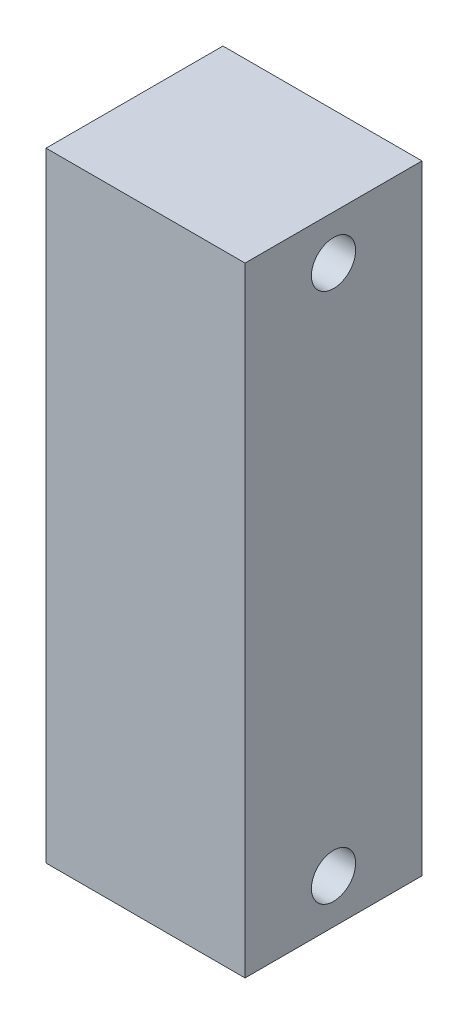
ISO-10303-21;
HEADER;
FILE_DESCRIPTION(('STEP AP214'),'2;1');
FILE_NAME('part.step','',(''),(''),'','','');
FILE_SCHEMA(('AUTOMOTIVE_DESIGN { 1 0 10303 214 1 1 1 1 }'));
ENDSEC;
DATA;
#1=APPLICATION_CONTEXT('core data for automotive mechanical design processes');
#2=APPLICATION_PROTOCOL_DEFINITION('international standard','automotive_design',2000,#1);
#3=PRODUCT_CONTEXT('',#1,'mechanical');
#4=PRODUCT('Part','Part','',(#3));
#5=PRODUCT_RELATED_PRODUCT_CATEGORY('part','',(#4));
#6=PRODUCT_DEFINITION_FORMATION('','',#4);
#7=PRODUCT_DEFINITION_CONTEXT('part definition',#1,'design');
#8=PRODUCT_DEFINITION('design','',#6,#7);
#9=PRODUCT_DEFINITION_SHAPE('','',#8);
#10=(LENGTH_UNIT() NAMED_UNIT(*) SI_UNIT(.MILLI.,.METRE.));
#11=(NAMED_UNIT(*) PLANE_ANGLE_UNIT() SI_UNIT($,.RADIAN.));
#12=(NAMED_UNIT(*) SI_UNIT($,.STERADIAN.) SOLID_ANGLE_UNIT());
#13=UNCERTAINTY_MEASURE_WITH_UNIT(LENGTH_MEASURE(1.E-05),#10,'distance_accuracy_value','');
#14=(GEOMETRIC_REPRESENTATION_CONTEXT(3) GLOBAL_UNCERTAINTY_ASSIGNED_CONTEXT((#13)) GLOBAL_UNIT_ASSIGNED_CONTEXT((#10,
#11,#12)) REPRESENTATION_CONTEXT('',''));
#15=CARTESIAN_POINT('',(0.,0.,0.));
#16=DIRECTION('',(0.,0.,1.));
#17=DIRECTION('',(1.,0.,0.));
#18=AXIS2_PLACEMENT_3D('',#15,#16,#17);
#19=CARTESIAN_POINT('',(22.5,140.,20.));
#20=DIRECTION('',(-1.,0.,0.));
#21=DIRECTION('',(0.,0.,1.));
#22=AXIS2_PLACEMENT_3D('',#19,#20,#21);
#23=PLANE('',#22);
#24=CARTESIAN_POINT('',(22.5,130.,0.));
#25=DIRECTION('',(1.,0.,0.));
#26=DIRECTION('',(0.,0.,-1.));
#27=AXIS2_PLACEMENT_3D('',#24,#25,#26);
#28=CIRCLE('',#27,5.);
#29=CARTESIAN_POINT('',(22.5,130.,-5.));
#30=VERTEX_POINT('',#29);
#31=EDGE_CURVE('E132',#30,#30,#28,.T.);
#32=ORIENTED_EDGE('',*,*,#31,.F.);
#33=EDGE_LOOP('',(#32));
#34=FACE_BOUND('',#33,.T.);
#35=CARTESIAN_POINT('',(22.5,10.,0.));
#36=DIRECTION('',(1.,0.,0.));
#37=DIRECTION('',(0.,0.,-1.));
#38=AXIS2_PLACEMENT_3D('',#35,#36,#37);
#39=CIRCLE('',#38,5.);
#40=CARTESIAN_POINT('',(22.5,10.,-5.));
#41=VERTEX_POINT('',#40);
#42=EDGE_CURVE('E133',#41,#41,#39,.T.);
#43=ORIENTED_EDGE('',*,*,#42,.F.);
#44=EDGE_LOOP('',(#43));
#45=FACE_BOUND('',#44,.T.);
#46=DIRECTION('',(0.,0.,-1.));
#47=VECTOR('',#46,1.);
#48=CARTESIAN_POINT('',(22.5,0.,20.));
#49=LINE('',#48,#47);
#50=CARTESIAN_POINT('',(22.5,0.,20.));
#51=VERTEX_POINT('',#50);
#52=CARTESIAN_POINT('',(22.5,0.,-20.));
#53=VERTEX_POINT('',#52);
#54=EDGE_CURVE('E107',#51,#53,#49,.T.);
#55=ORIENTED_EDGE('',*,*,#54,.T.);
#56=DIRECTION('',(0.,-1.,0.));
#57=VECTOR('',#56,1.);
#58=CARTESIAN_POINT('',(22.5,140.,-20.));
#59=LINE('',#58,#57);
#60=CARTESIAN_POINT('',(22.5,140.,-20.));
#61=VERTEX_POINT('',#60);
#62=EDGE_CURVE('E11',#61,#53,#59,.T.);
#63=ORIENTED_EDGE('',*,*,#62,.F.);
#64=DIRECTION('',(0.,0.,-1.));
#65=VECTOR('',#64,1.);
#66=CARTESIAN_POINT('',(22.5,140.,20.));
#67=LINE('',#66,#65);
#68=CARTESIAN_POINT('',(22.5,140.,20.));
#69=VERTEX_POINT('',#68);
#70=EDGE_CURVE('E91',#69,#61,#67,.T.);
#71=ORIENTED_EDGE('',*,*,#70,.F.);
#72=DIRECTION('',(0.,-1.,0.));
#73=VECTOR('',#72,1.);
#74=CARTESIAN_POINT('',(22.5,140.,20.));
#75=LINE('',#74,#73);
#76=EDGE_CURVE('E103',#69,#51,#75,.T.);
#77=ORIENTED_EDGE('',*,*,#76,.T.);
#78=EDGE_LOOP('',(#55,#63,#71,#77));
#79=FACE_BOUND('',#78,.T.);
#80=ADVANCED_FACE('F39',(#34,#45,#79),#23,.F.);
#81=CARTESIAN_POINT('',(-22.5,140.,-20.));
#82=DIRECTION('',(0.,0.,1.));
#83=DIRECTION('',(1.,0.,0.));
#84=AXIS2_PLACEMENT_3D('',#81,#82,#83);
#85=PLANE('',#84);
#86=DIRECTION('',(-1.,0.,0.));
#87=VECTOR('',#86,1.);
#88=CARTESIAN_POINT('',(-22.5,0.,-20.));
#89=LINE('',#88,#87);
#90=CARTESIAN_POINT('',(-22.5,0.,-20.));
#91=VERTEX_POINT('',#90);
#92=EDGE_CURVE('E96',#53,#91,#89,.T.);
#93=ORIENTED_EDGE('',*,*,#92,.T.);
#94=DIRECTION('',(0.,-1.,0.));
#95=VECTOR('',#94,1.);
#96=CARTESIAN_POINT('',(-22.5,140.,-20.));
#97=LINE('',#96,#95);
#98=CARTESIAN_POINT('',(-22.5,140.,-20.));
#99=VERTEX_POINT('',#98);
#100=EDGE_CURVE('E48',#99,#91,#97,.T.);
#101=ORIENTED_EDGE('',*,*,#100,.F.);
#102=DIRECTION('',(-1.,0.,0.));
#103=VECTOR('',#102,1.);
#104=CARTESIAN_POINT('',(-22.5,140.,-20.));
#105=LINE('',#104,#103);
#106=EDGE_CURVE('E86',#61,#99,#105,.T.);
#107=ORIENTED_EDGE('',*,*,#106,.F.);
#108=ORIENTED_EDGE('',*,*,#62,.T.);
#109=EDGE_LOOP('',(#93,#101,#107,#108));
#110=FACE_BOUND('',#109,.T.);
#111=ADVANCED_FACE('F95',(#110),#85,.F.);
#112=CARTESIAN_POINT('',(-22.5,140.,20.));
#113=DIRECTION('',(1.,0.,0.));
#114=DIRECTION('',(0.,0.,-1.));
#115=AXIS2_PLACEMENT_3D('',#112,#113,#114);
#116=PLANE('',#115);
#117=CARTESIAN_POINT('',(-22.5,130.,0.));
#118=DIRECTION('',(1.,0.,0.));
#119=DIRECTION('',(0.,0.,-1.));
#120=AXIS2_PLACEMENT_3D('',#117,#118,#119);
#121=CIRCLE('',#120,5.);
#122=CARTESIAN_POINT('',(-22.5,130.,-5.));
#123=VERTEX_POINT('',#122);
#124=EDGE_CURVE('E111',#123,#123,#121,.F.);
#125=ORIENTED_EDGE('',*,*,#124,.F.);
#126=EDGE_LOOP('',(#125));
#127=FACE_BOUND('',#126,.T.);
#128=CARTESIAN_POINT('',(-22.5,10.,0.));
#129=DIRECTION('',(1.,0.,0.));
#130=DIRECTION('',(0.,0.,-1.));
#131=AXIS2_PLACEMENT_3D('',#128,#129,#130);
#132=CIRCLE('',#131,5.);
#133=CARTESIAN_POINT('',(-22.5,10.,-5.));
#134=VERTEX_POINT('',#133);
#135=EDGE_CURVE('E128',#134,#134,#132,.F.);
#136=ORIENTED_EDGE('',*,*,#135,.F.);
#137=EDGE_LOOP('',(#136));
#138=FACE_BOUND('',#137,.T.);
#139=DIRECTION('',(0.,0.,1.));
#140=VECTOR('',#139,1.);
#141=CARTESIAN_POINT('',(-22.5,0.,20.));
#142=LINE('',#141,#140);
#143=CARTESIAN_POINT('',(-22.5,0.,20.));
#144=VERTEX_POINT('',#143);
#145=EDGE_CURVE('E73',#91,#144,#142,.T.);
#146=ORIENTED_EDGE('',*,*,#145,.T.);
#147=DIRECTION('',(0.,-1.,0.));
#148=VECTOR('',#147,1.);
#149=CARTESIAN_POINT('',(-22.5,140.,20.));
#150=LINE('',#149,#148);
#151=CARTESIAN_POINT('',(-22.5,140.,20.));
#152=VERTEX_POINT('',#151);
#153=EDGE_CURVE('E98',#152,#144,#150,.T.);
#154=ORIENTED_EDGE('',*,*,#153,.F.);
#155=DIRECTION('',(0.,0.,1.));
#156=VECTOR('',#155,1.);
#157=CARTESIAN_POINT('',(-22.5,140.,20.));
#158=LINE('',#157,#156);
#159=EDGE_CURVE('E89',#99,#152,#158,.T.);
#160=ORIENTED_EDGE('',*,*,#159,.F.);
#161=ORIENTED_EDGE('',*,*,#100,.T.);
#162=EDGE_LOOP('',(#146,#154,#160,#161));
#163=FACE_BOUND('',#162,.T.);
#164=ADVANCED_FACE('F99',(#127,#138,#163),#116,.F.);
#165=CARTESIAN_POINT('',(-22.5,140.,20.));
#166=DIRECTION('',(0.,0.,-1.));
#167=DIRECTION('',(-1.,0.,0.));
#168=AXIS2_PLACEMENT_3D('',#165,#166,#167);
#169=PLANE('',#168);
#170=DIRECTION('',(1.,0.,0.));
#171=VECTOR('',#170,1.);
#172=CARTESIAN_POINT('',(-22.5,0.,20.));
#173=LINE('',#172,#171);
#174=EDGE_CURVE('E79',#144,#51,#173,.T.);
#175=ORIENTED_EDGE('',*,*,#174,.T.);
#176=ORIENTED_EDGE('',*,*,#76,.F.);
#177=DIRECTION('',(1.,0.,0.));
#178=VECTOR('',#177,1.);
#179=CARTESIAN_POINT('',(-22.5,140.,20.));
#180=LINE('',#179,#178);
#181=EDGE_CURVE('E56',#152,#69,#180,.T.);
#182=ORIENTED_EDGE('',*,*,#181,.F.);
#183=ORIENTED_EDGE('',*,*,#153,.T.);
#184=EDGE_LOOP('',(#175,#176,#182,#183));
#185=FACE_BOUND('',#184,.T.);
#186=ADVANCED_FACE('F121',(#185),#169,.F.);
#187=CARTESIAN_POINT('',(0.,140.,0.));
#188=DIRECTION('',(0.,-1.,0.));
#189=DIRECTION('',(0.,0.,-1.));
#190=AXIS2_PLACEMENT_3D('',#187,#188,#189);
#191=PLANE('',#190);
#192=ORIENTED_EDGE('',*,*,#70,.T.);
#193=ORIENTED_EDGE('',*,*,#106,.T.);
#194=ORIENTED_EDGE('',*,*,#159,.T.);
#195=ORIENTED_EDGE('',*,*,#181,.T.);
#196=EDGE_LOOP('',(#192,#193,#194,#195));
#197=FACE_BOUND('',#196,.T.);
#198=ADVANCED_FACE('F87',(#197),#191,.F.);
#199=CARTESIAN_POINT('',(0.,0.,0.));
#200=DIRECTION('',(0.,-1.,0.));
#201=DIRECTION('',(0.,0.,-1.));
#202=AXIS2_PLACEMENT_3D('',#199,#200,#201);
#203=PLANE('',#202);
#204=ORIENTED_EDGE('',*,*,#54,.F.);
#205=ORIENTED_EDGE('',*,*,#174,.F.);
#206=ORIENTED_EDGE('',*,*,#145,.F.);
#207=ORIENTED_EDGE('',*,*,#92,.F.);
#208=EDGE_LOOP('',(#204,#205,#206,#207));
#209=FACE_BOUND('',#208,.T.);
#210=ADVANCED_FACE('F124',(#209),#203,.T.);
#211=CARTESIAN_POINT('',(-36.642135623731,10.,0.));
#212=DIRECTION('',(1.,0.,0.));
#213=DIRECTION('',(0.,0.,-1.));
#214=AXIS2_PLACEMENT_3D('',#211,#212,#213);
#215=CYLINDRICAL_SURFACE('',#214,5.);
#216=ORIENTED_EDGE('',*,*,#135,.T.);
#217=EDGE_LOOP('',(#216));
#218=FACE_BOUND('',#217,.T.);
#219=ORIENTED_EDGE('',*,*,#42,.T.);
#220=EDGE_LOOP('',(#219));
#221=FACE_BOUND('',#220,.T.);
#222=ADVANCED_FACE('F150',(#218,#221),#215,.F.);
#223=CARTESIAN_POINT('',(-36.642135623731,130.,0.));
#224=DIRECTION('',(1.,0.,0.));
#225=DIRECTION('',(0.,0.,-1.));
#226=AXIS2_PLACEMENT_3D('',#223,#224,#225);
#227=CYLINDRICAL_SURFACE('',#226,5.);
#228=ORIENTED_EDGE('',*,*,#124,.T.);
#229=EDGE_LOOP('',(#228));
#230=FACE_BOUND('',#229,.T.);
#231=ORIENTED_EDGE('',*,*,#31,.T.);
#232=EDGE_LOOP('',(#231));
#233=FACE_BOUND('',#232,.T.);
#234=ADVANCED_FACE('F144',(#230,#233),#227,.F.);
#235=CLOSED_SHELL('',(#80,#111,#164,#186,#198,#210,#222,#234));
#236=MANIFOLD_SOLID_BREP('B2',#235);
#237=ADVANCED_BREP_SHAPE_REPRESENTATION('',(#18,#236),#14);
#238=SHAPE_DEFINITION_REPRESENTATION(#9,#237);
ENDSEC;
END-ISO-10303-21;
